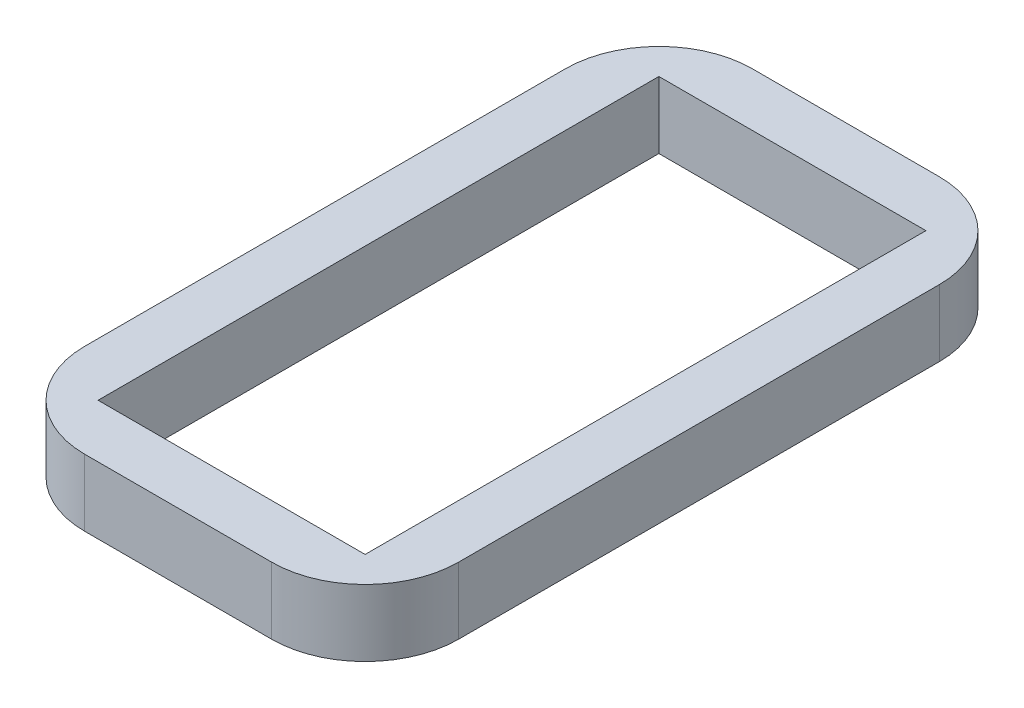
ISO-10303-21;
HEADER;
FILE_DESCRIPTION(('STEP AP214'),'2;1');
FILE_NAME('part.step','',(''),(''),'','','');
FILE_SCHEMA(('AUTOMOTIVE_DESIGN { 1 0 10303 214 1 1 1 1 }'));
ENDSEC;
DATA;
#1=APPLICATION_CONTEXT('core data for automotive mechanical design processes');
#2=APPLICATION_PROTOCOL_DEFINITION('international standard','automotive_design',2000,#1);
#3=PRODUCT_CONTEXT('',#1,'mechanical');
#4=PRODUCT('Part','Part','',(#3));
#5=PRODUCT_RELATED_PRODUCT_CATEGORY('part','',(#4));
#6=PRODUCT_DEFINITION_FORMATION('','',#4);
#7=PRODUCT_DEFINITION_CONTEXT('part definition',#1,'design');
#8=PRODUCT_DEFINITION('design','',#6,#7);
#9=PRODUCT_DEFINITION_SHAPE('','',#8);
#10=(LENGTH_UNIT() NAMED_UNIT(*) SI_UNIT(.MILLI.,.METRE.));
#11=(NAMED_UNIT(*) PLANE_ANGLE_UNIT() SI_UNIT($,.RADIAN.));
#12=(NAMED_UNIT(*) SI_UNIT($,.STERADIAN.) SOLID_ANGLE_UNIT());
#13=UNCERTAINTY_MEASURE_WITH_UNIT(LENGTH_MEASURE(1.E-05),#10,'distance_accuracy_value','');
#14=(GEOMETRIC_REPRESENTATION_CONTEXT(3) GLOBAL_UNCERTAINTY_ASSIGNED_CONTEXT((#13)) GLOBAL_UNIT_ASSIGNED_CONTEXT((#10,
#11,#12)) REPRESENTATION_CONTEXT('',''));
#15=CARTESIAN_POINT('',(0.,0.,0.));
#16=DIRECTION('',(0.,0.,1.));
#17=DIRECTION('',(1.,0.,0.));
#18=AXIS2_PLACEMENT_3D('',#15,#16,#17);
#19=CARTESIAN_POINT('',(0.,5.,0.));
#20=DIRECTION('',(0.,1.,0.));
#21=DIRECTION('',(0.,0.,1.));
#22=AXIS2_PLACEMENT_3D('',#19,#20,#21);
#23=PLANE('',#22);
#24=DIRECTION('',(-1.,0.,0.));
#25=VECTOR('',#24,1.);
#26=CARTESIAN_POINT('',(-14.,5.,-25.));
#27=LINE('',#26,#25);
#28=CARTESIAN_POINT('',(7.,5.,-25.));
#29=VERTEX_POINT('',#28);
#30=CARTESIAN_POINT('',(-7.,5.,-25.));
#31=VERTEX_POINT('',#30);
#32=EDGE_CURVE('E167',#29,#31,#27,.T.);
#33=ORIENTED_EDGE('',*,*,#32,.T.);
#34=CARTESIAN_POINT('',(-7.,5.,-18.));
#35=DIRECTION('',(0.,1.,0.));
#36=DIRECTION('',(0.,0.,1.));
#37=AXIS2_PLACEMENT_3D('',#34,#35,#36);
#38=CIRCLE('',#37,7.);
#39=CARTESIAN_POINT('',(-14.,5.,-18.));
#40=VERTEX_POINT('',#39);
#41=EDGE_CURVE('E207',#31,#40,#38,.T.);
#42=ORIENTED_EDGE('',*,*,#41,.T.);
#43=DIRECTION('',(0.,0.,1.));
#44=VECTOR('',#43,1.);
#45=CARTESIAN_POINT('',(-14.,5.,-25.));
#46=LINE('',#45,#44);
#47=CARTESIAN_POINT('',(-14.,5.,18.));
#48=VERTEX_POINT('',#47);
#49=EDGE_CURVE('E171',#40,#48,#46,.T.);
#50=ORIENTED_EDGE('',*,*,#49,.T.);
#51=CARTESIAN_POINT('',(-7.,5.,18.));
#52=DIRECTION('',(0.,1.,0.));
#53=DIRECTION('',(0.,0.,1.));
#54=AXIS2_PLACEMENT_3D('',#51,#52,#53);
#55=CIRCLE('',#54,7.);
#56=CARTESIAN_POINT('',(-7.,5.,25.));
#57=VERTEX_POINT('',#56);
#58=EDGE_CURVE('E53',#48,#57,#55,.T.);
#59=ORIENTED_EDGE('',*,*,#58,.T.);
#60=DIRECTION('',(1.,0.,0.));
#61=VECTOR('',#60,1.);
#62=CARTESIAN_POINT('',(-14.,5.,25.));
#63=LINE('',#62,#61);
#64=CARTESIAN_POINT('',(7.,5.,25.));
#65=VERTEX_POINT('',#64);
#66=EDGE_CURVE('E173',#57,#65,#63,.T.);
#67=ORIENTED_EDGE('',*,*,#66,.T.);
#68=CARTESIAN_POINT('',(7.,5.,18.));
#69=DIRECTION('',(0.,1.,0.));
#70=DIRECTION('',(0.,0.,1.));
#71=AXIS2_PLACEMENT_3D('',#68,#69,#70);
#72=CIRCLE('',#71,7.);
#73=CARTESIAN_POINT('',(14.,5.,18.));
#74=VERTEX_POINT('',#73);
#75=EDGE_CURVE('E203',#65,#74,#72,.T.);
#76=ORIENTED_EDGE('',*,*,#75,.T.);
#77=DIRECTION('',(0.,0.,-1.));
#78=VECTOR('',#77,1.);
#79=CARTESIAN_POINT('',(14.,5.,-25.));
#80=LINE('',#79,#78);
#81=CARTESIAN_POINT('',(14.,5.,-18.));
#82=VERTEX_POINT('',#81);
#83=EDGE_CURVE('E164',#74,#82,#80,.T.);
#84=ORIENTED_EDGE('',*,*,#83,.T.);
#85=CARTESIAN_POINT('',(7.,5.,-18.));
#86=DIRECTION('',(0.,1.,0.));
#87=DIRECTION('',(0.,0.,1.));
#88=AXIS2_PLACEMENT_3D('',#85,#86,#87);
#89=CIRCLE('',#88,7.);
#90=EDGE_CURVE('E205',#82,#29,#89,.T.);
#91=ORIENTED_EDGE('',*,*,#90,.T.);
#92=EDGE_LOOP('',(#33,#42,#50,#59,#67,#76,#84,#91));
#93=FACE_BOUND('',#92,.T.);
#94=DIRECTION('',(-1.,0.,0.));
#95=VECTOR('',#94,1.);
#96=CARTESIAN_POINT('',(-9.99999999999999,5.,-21.));
#97=LINE('',#96,#95);
#98=CARTESIAN_POINT('',(10.,5.,-21.));
#99=VERTEX_POINT('',#98);
#100=CARTESIAN_POINT('',(-9.99999999999999,5.,-21.));
#101=VERTEX_POINT('',#100);
#102=EDGE_CURVE('E133',#99,#101,#97,.T.);
#103=ORIENTED_EDGE('',*,*,#102,.F.);
#104=DIRECTION('',(0.,0.,-1.));
#105=VECTOR('',#104,1.);
#106=CARTESIAN_POINT('',(10.,5.,-21.));
#107=LINE('',#106,#105);
#108=CARTESIAN_POINT('',(10.,5.,21.));
#109=VERTEX_POINT('',#108);
#110=EDGE_CURVE('E123',#109,#99,#107,.T.);
#111=ORIENTED_EDGE('',*,*,#110,.F.);
#112=DIRECTION('',(1.,0.,0.));
#113=VECTOR('',#112,1.);
#114=CARTESIAN_POINT('',(-9.99999999999999,5.,21.));
#115=LINE('',#114,#113);
#116=CARTESIAN_POINT('',(-9.99999999999999,5.,21.));
#117=VERTEX_POINT('',#116);
#118=EDGE_CURVE('E148',#117,#109,#115,.T.);
#119=ORIENTED_EDGE('',*,*,#118,.F.);
#120=DIRECTION('',(0.,0.,1.));
#121=VECTOR('',#120,1.);
#122=CARTESIAN_POINT('',(-9.99999999999999,5.,-21.));
#123=LINE('',#122,#121);
#124=EDGE_CURVE('E146',#101,#117,#123,.T.);
#125=ORIENTED_EDGE('',*,*,#124,.F.);
#126=EDGE_LOOP('',(#103,#111,#119,#125));
#127=FACE_BOUND('',#126,.T.);
#128=ADVANCED_FACE('F33',(#93,#127),#23,.T.);
#129=CARTESIAN_POINT('',(0.,0.,0.));
#130=DIRECTION('',(0.,1.,0.));
#131=DIRECTION('',(0.,0.,1.));
#132=AXIS2_PLACEMENT_3D('',#129,#130,#131);
#133=PLANE('',#132);
#134=DIRECTION('',(0.,0.,1.));
#135=VECTOR('',#134,1.);
#136=CARTESIAN_POINT('',(-14.,0.,-25.));
#137=LINE('',#136,#135);
#138=CARTESIAN_POINT('',(-14.,0.,-18.));
#139=VERTEX_POINT('',#138);
#140=CARTESIAN_POINT('',(-14.,0.,18.));
#141=VERTEX_POINT('',#140);
#142=EDGE_CURVE('E181',#139,#141,#137,.T.);
#143=ORIENTED_EDGE('',*,*,#142,.F.);
#144=CARTESIAN_POINT('',(-7.,0.,-18.));
#145=DIRECTION('',(0.,1.,0.));
#146=DIRECTION('',(0.,0.,1.));
#147=AXIS2_PLACEMENT_3D('',#144,#145,#146);
#148=CIRCLE('',#147,7.);
#149=CARTESIAN_POINT('',(-7.,0.,-25.));
#150=VERTEX_POINT('',#149);
#151=EDGE_CURVE('E195',#139,#150,#148,.F.);
#152=ORIENTED_EDGE('',*,*,#151,.T.);
#153=DIRECTION('',(-1.,0.,0.));
#154=VECTOR('',#153,1.);
#155=CARTESIAN_POINT('',(-14.,0.,-25.));
#156=LINE('',#155,#154);
#157=CARTESIAN_POINT('',(7.,0.,-25.));
#158=VERTEX_POINT('',#157);
#159=EDGE_CURVE('E178',#158,#150,#156,.T.);
#160=ORIENTED_EDGE('',*,*,#159,.F.);
#161=CARTESIAN_POINT('',(7.,0.,-18.));
#162=DIRECTION('',(0.,1.,0.));
#163=DIRECTION('',(0.,0.,1.));
#164=AXIS2_PLACEMENT_3D('',#161,#162,#163);
#165=CIRCLE('',#164,7.);
#166=CARTESIAN_POINT('',(14.,0.,-18.));
#167=VERTEX_POINT('',#166);
#168=EDGE_CURVE('E193',#158,#167,#165,.F.);
#169=ORIENTED_EDGE('',*,*,#168,.T.);
#170=DIRECTION('',(0.,0.,-1.));
#171=VECTOR('',#170,1.);
#172=CARTESIAN_POINT('',(14.,0.,-25.));
#173=LINE('',#172,#171);
#174=CARTESIAN_POINT('',(14.,0.,18.));
#175=VERTEX_POINT('',#174);
#176=EDGE_CURVE('E141',#175,#167,#173,.T.);
#177=ORIENTED_EDGE('',*,*,#176,.F.);
#178=CARTESIAN_POINT('',(7.,0.,18.));
#179=DIRECTION('',(0.,1.,0.));
#180=DIRECTION('',(0.,0.,1.));
#181=AXIS2_PLACEMENT_3D('',#178,#179,#180);
#182=CIRCLE('',#181,7.);
#183=CARTESIAN_POINT('',(7.,0.,25.));
#184=VERTEX_POINT('',#183);
#185=EDGE_CURVE('E191',#175,#184,#182,.F.);
#186=ORIENTED_EDGE('',*,*,#185,.T.);
#187=DIRECTION('',(1.,0.,0.));
#188=VECTOR('',#187,1.);
#189=CARTESIAN_POINT('',(-14.,0.,25.));
#190=LINE('',#189,#188);
#191=CARTESIAN_POINT('',(-7.,0.,25.));
#192=VERTEX_POINT('',#191);
#193=EDGE_CURVE('E168',#192,#184,#190,.T.);
#194=ORIENTED_EDGE('',*,*,#193,.F.);
#195=CARTESIAN_POINT('',(-7.,0.,18.));
#196=DIRECTION('',(0.,1.,0.));
#197=DIRECTION('',(0.,0.,1.));
#198=AXIS2_PLACEMENT_3D('',#195,#196,#197);
#199=CIRCLE('',#198,7.);
#200=EDGE_CURVE('E189',#192,#141,#199,.F.);
#201=ORIENTED_EDGE('',*,*,#200,.T.);
#202=EDGE_LOOP('',(#143,#152,#160,#169,#177,#186,#194,#201));
#203=FACE_BOUND('',#202,.T.);
#204=DIRECTION('',(0.,0.,-1.));
#205=VECTOR('',#204,1.);
#206=CARTESIAN_POINT('',(10.,0.,-21.));
#207=LINE('',#206,#205);
#208=CARTESIAN_POINT('',(10.,0.,21.));
#209=VERTEX_POINT('',#208);
#210=CARTESIAN_POINT('',(10.,0.,-21.));
#211=VERTEX_POINT('',#210);
#212=EDGE_CURVE('E152',#209,#211,#207,.T.);
#213=ORIENTED_EDGE('',*,*,#212,.T.);
#214=DIRECTION('',(-1.,0.,0.));
#215=VECTOR('',#214,1.);
#216=CARTESIAN_POINT('',(-9.99999999999999,0.,-21.));
#217=LINE('',#216,#215);
#218=CARTESIAN_POINT('',(-9.99999999999999,0.,-21.));
#219=VERTEX_POINT('',#218);
#220=EDGE_CURVE('E140',#211,#219,#217,.T.);
#221=ORIENTED_EDGE('',*,*,#220,.T.);
#222=DIRECTION('',(0.,0.,1.));
#223=VECTOR('',#222,1.);
#224=CARTESIAN_POINT('',(-9.99999999999999,0.,-21.));
#225=LINE('',#224,#223);
#226=CARTESIAN_POINT('',(-9.99999999999999,0.,21.));
#227=VERTEX_POINT('',#226);
#228=EDGE_CURVE('E155',#219,#227,#225,.T.);
#229=ORIENTED_EDGE('',*,*,#228,.T.);
#230=DIRECTION('',(1.,0.,0.));
#231=VECTOR('',#230,1.);
#232=CARTESIAN_POINT('',(-9.99999999999999,0.,21.));
#233=LINE('',#232,#231);
#234=EDGE_CURVE('E134',#227,#209,#233,.T.);
#235=ORIENTED_EDGE('',*,*,#234,.T.);
#236=EDGE_LOOP('',(#213,#221,#229,#235));
#237=FACE_BOUND('',#236,.T.);
#238=ADVANCED_FACE('F220',(#203,#237),#133,.F.);
#239=CARTESIAN_POINT('',(14.,5.,-25.));
#240=DIRECTION('',(-1.,0.,0.));
#241=DIRECTION('',(0.,0.,1.));
#242=AXIS2_PLACEMENT_3D('',#239,#240,#241);
#243=PLANE('',#242);
#244=ORIENTED_EDGE('',*,*,#176,.T.);
#245=DIRECTION('',(0.,-1.,0.));
#246=VECTOR('',#245,1.);
#247=CARTESIAN_POINT('',(14.,5.,-18.));
#248=LINE('',#247,#246);
#249=EDGE_CURVE('E212',#167,#82,#248,.F.);
#250=ORIENTED_EDGE('',*,*,#249,.T.);
#251=ORIENTED_EDGE('',*,*,#83,.F.);
#252=DIRECTION('',(0.,-1.,0.));
#253=VECTOR('',#252,1.);
#254=CARTESIAN_POINT('',(14.,5.,18.));
#255=LINE('',#254,#253);
#256=EDGE_CURVE('E209',#74,#175,#255,.T.);
#257=ORIENTED_EDGE('',*,*,#256,.T.);
#258=EDGE_LOOP('',(#244,#250,#251,#257));
#259=FACE_BOUND('',#258,.T.);
#260=ADVANCED_FACE('F229',(#259),#243,.F.);
#261=CARTESIAN_POINT('',(-14.,5.,-25.));
#262=DIRECTION('',(0.,0.,1.));
#263=DIRECTION('',(1.,0.,0.));
#264=AXIS2_PLACEMENT_3D('',#261,#262,#263);
#265=PLANE('',#264);
#266=ORIENTED_EDGE('',*,*,#159,.T.);
#267=DIRECTION('',(0.,-1.,0.));
#268=VECTOR('',#267,1.);
#269=CARTESIAN_POINT('',(-7.,5.,-25.));
#270=LINE('',#269,#268);
#271=EDGE_CURVE('E200',#150,#31,#270,.F.);
#272=ORIENTED_EDGE('',*,*,#271,.T.);
#273=ORIENTED_EDGE('',*,*,#32,.F.);
#274=DIRECTION('',(0.,-1.,0.));
#275=VECTOR('',#274,1.);
#276=CARTESIAN_POINT('',(7.,5.,-25.));
#277=LINE('',#276,#275);
#278=EDGE_CURVE('E197',#29,#158,#277,.T.);
#279=ORIENTED_EDGE('',*,*,#278,.T.);
#280=EDGE_LOOP('',(#266,#272,#273,#279));
#281=FACE_BOUND('',#280,.T.);
#282=ADVANCED_FACE('F238',(#281),#265,.F.);
#283=CARTESIAN_POINT('',(-14.,5.,-25.));
#284=DIRECTION('',(1.,0.,0.));
#285=DIRECTION('',(0.,0.,-1.));
#286=AXIS2_PLACEMENT_3D('',#283,#284,#285);
#287=PLANE('',#286);
#288=ORIENTED_EDGE('',*,*,#49,.F.);
#289=DIRECTION('',(0.,-1.,0.));
#290=VECTOR('',#289,1.);
#291=CARTESIAN_POINT('',(-14.,5.,-18.));
#292=LINE('',#291,#290);
#293=EDGE_CURVE('E186',#40,#139,#292,.T.);
#294=ORIENTED_EDGE('',*,*,#293,.T.);
#295=ORIENTED_EDGE('',*,*,#142,.T.);
#296=DIRECTION('',(0.,-1.,0.));
#297=VECTOR('',#296,1.);
#298=CARTESIAN_POINT('',(-14.,5.,18.));
#299=LINE('',#298,#297);
#300=EDGE_CURVE('E175',#141,#48,#299,.F.);
#301=ORIENTED_EDGE('',*,*,#300,.T.);
#302=EDGE_LOOP('',(#288,#294,#295,#301));
#303=FACE_BOUND('',#302,.T.);
#304=ADVANCED_FACE('F246',(#303),#287,.F.);
#305=CARTESIAN_POINT('',(-14.,5.,25.));
#306=DIRECTION('',(0.,0.,-1.));
#307=DIRECTION('',(-1.,0.,0.));
#308=AXIS2_PLACEMENT_3D('',#305,#306,#307);
#309=PLANE('',#308);
#310=ORIENTED_EDGE('',*,*,#193,.T.);
#311=DIRECTION('',(0.,-1.,0.));
#312=VECTOR('',#311,1.);
#313=CARTESIAN_POINT('',(7.,5.,25.));
#314=LINE('',#313,#312);
#315=EDGE_CURVE('E11',#184,#65,#314,.F.);
#316=ORIENTED_EDGE('',*,*,#315,.T.);
#317=ORIENTED_EDGE('',*,*,#66,.F.);
#318=DIRECTION('',(0.,-1.,0.));
#319=VECTOR('',#318,1.);
#320=CARTESIAN_POINT('',(-7.,5.,25.));
#321=LINE('',#320,#319);
#322=EDGE_CURVE('E41',#57,#192,#321,.T.);
#323=ORIENTED_EDGE('',*,*,#322,.T.);
#324=EDGE_LOOP('',(#310,#316,#317,#323));
#325=FACE_BOUND('',#324,.T.);
#326=ADVANCED_FACE('F216',(#325),#309,.F.);
#327=CARTESIAN_POINT('',(10.,5.,-21.));
#328=DIRECTION('',(-1.,0.,0.));
#329=DIRECTION('',(0.,0.,1.));
#330=AXIS2_PLACEMENT_3D('',#327,#328,#329);
#331=PLANE('',#330);
#332=ORIENTED_EDGE('',*,*,#212,.F.);
#333=DIRECTION('',(0.,-1.,0.));
#334=VECTOR('',#333,1.);
#335=CARTESIAN_POINT('',(10.,5.,21.));
#336=LINE('',#335,#334);
#337=EDGE_CURVE('E129',#109,#209,#336,.T.);
#338=ORIENTED_EDGE('',*,*,#337,.F.);
#339=ORIENTED_EDGE('',*,*,#110,.T.);
#340=DIRECTION('',(0.,-1.,0.));
#341=VECTOR('',#340,1.);
#342=CARTESIAN_POINT('',(10.,5.,-21.));
#343=LINE('',#342,#341);
#344=EDGE_CURVE('E126',#99,#211,#343,.T.);
#345=ORIENTED_EDGE('',*,*,#344,.T.);
#346=EDGE_LOOP('',(#332,#338,#339,#345));
#347=FACE_BOUND('',#346,.T.);
#348=ADVANCED_FACE('F125',(#347),#331,.T.);
#349=CARTESIAN_POINT('',(-9.99999999999999,5.,-21.));
#350=DIRECTION('',(0.,0.,1.));
#351=DIRECTION('',(1.,0.,0.));
#352=AXIS2_PLACEMENT_3D('',#349,#350,#351);
#353=PLANE('',#352);
#354=ORIENTED_EDGE('',*,*,#220,.F.);
#355=ORIENTED_EDGE('',*,*,#344,.F.);
#356=ORIENTED_EDGE('',*,*,#102,.T.);
#357=DIRECTION('',(0.,-1.,0.));
#358=VECTOR('',#357,1.);
#359=CARTESIAN_POINT('',(-9.99999999999999,5.,-21.));
#360=LINE('',#359,#358);
#361=EDGE_CURVE('E142',#101,#219,#360,.T.);
#362=ORIENTED_EDGE('',*,*,#361,.T.);
#363=EDGE_LOOP('',(#354,#355,#356,#362));
#364=FACE_BOUND('',#363,.T.);
#365=ADVANCED_FACE('F137',(#364),#353,.T.);
#366=CARTESIAN_POINT('',(-9.99999999999999,5.,-21.));
#367=DIRECTION('',(1.,0.,0.));
#368=DIRECTION('',(0.,0.,-1.));
#369=AXIS2_PLACEMENT_3D('',#366,#367,#368);
#370=PLANE('',#369);
#371=ORIENTED_EDGE('',*,*,#228,.F.);
#372=ORIENTED_EDGE('',*,*,#361,.F.);
#373=ORIENTED_EDGE('',*,*,#124,.T.);
#374=DIRECTION('',(0.,-1.,0.));
#375=VECTOR('',#374,1.);
#376=CARTESIAN_POINT('',(-9.99999999999999,5.,21.));
#377=LINE('',#376,#375);
#378=EDGE_CURVE('E161',#117,#227,#377,.T.);
#379=ORIENTED_EDGE('',*,*,#378,.T.);
#380=EDGE_LOOP('',(#371,#372,#373,#379));
#381=FACE_BOUND('',#380,.T.);
#382=ADVANCED_FACE('F302',(#381),#370,.T.);
#383=CARTESIAN_POINT('',(-9.99999999999999,5.,21.));
#384=DIRECTION('',(0.,0.,-1.));
#385=DIRECTION('',(-1.,0.,0.));
#386=AXIS2_PLACEMENT_3D('',#383,#384,#385);
#387=PLANE('',#386);
#388=ORIENTED_EDGE('',*,*,#234,.F.);
#389=ORIENTED_EDGE('',*,*,#378,.F.);
#390=ORIENTED_EDGE('',*,*,#118,.T.);
#391=ORIENTED_EDGE('',*,*,#337,.T.);
#392=EDGE_LOOP('',(#388,#389,#390,#391));
#393=FACE_BOUND('',#392,.T.);
#394=ADVANCED_FACE('F271',(#393),#387,.T.);
#395=CARTESIAN_POINT('',(-7.,5.,-18.));
#396=DIRECTION('',(0.,-1.,0.));
#397=DIRECTION('',(0.,0.,-1.));
#398=AXIS2_PLACEMENT_3D('',#395,#396,#397);
#399=CYLINDRICAL_SURFACE('',#398,7.);
#400=ORIENTED_EDGE('',*,*,#41,.F.);
#401=ORIENTED_EDGE('',*,*,#271,.F.);
#402=ORIENTED_EDGE('',*,*,#151,.F.);
#403=ORIENTED_EDGE('',*,*,#293,.F.);
#404=EDGE_LOOP('',(#400,#401,#402,#403));
#405=FACE_BOUND('',#404,.T.);
#406=ADVANCED_FACE('F243',(#405),#399,.T.);
#407=CARTESIAN_POINT('',(7.,5.,-18.));
#408=DIRECTION('',(0.,-1.,0.));
#409=DIRECTION('',(0.,0.,-1.));
#410=AXIS2_PLACEMENT_3D('',#407,#408,#409);
#411=CYLINDRICAL_SURFACE('',#410,7.);
#412=ORIENTED_EDGE('',*,*,#90,.F.);
#413=ORIENTED_EDGE('',*,*,#249,.F.);
#414=ORIENTED_EDGE('',*,*,#168,.F.);
#415=ORIENTED_EDGE('',*,*,#278,.F.);
#416=EDGE_LOOP('',(#412,#413,#414,#415));
#417=FACE_BOUND('',#416,.T.);
#418=ADVANCED_FACE('F235',(#417),#411,.T.);
#419=CARTESIAN_POINT('',(7.,5.,18.));
#420=DIRECTION('',(0.,-1.,0.));
#421=DIRECTION('',(0.,0.,-1.));
#422=AXIS2_PLACEMENT_3D('',#419,#420,#421);
#423=CYLINDRICAL_SURFACE('',#422,7.);
#424=ORIENTED_EDGE('',*,*,#75,.F.);
#425=ORIENTED_EDGE('',*,*,#315,.F.);
#426=ORIENTED_EDGE('',*,*,#185,.F.);
#427=ORIENTED_EDGE('',*,*,#256,.F.);
#428=EDGE_LOOP('',(#424,#425,#426,#427));
#429=FACE_BOUND('',#428,.T.);
#430=ADVANCED_FACE('F226',(#429),#423,.T.);
#431=CARTESIAN_POINT('',(-7.,5.,18.));
#432=DIRECTION('',(0.,-1.,0.));
#433=DIRECTION('',(0.,0.,-1.));
#434=AXIS2_PLACEMENT_3D('',#431,#432,#433);
#435=CYLINDRICAL_SURFACE('',#434,7.);
#436=ORIENTED_EDGE('',*,*,#58,.F.);
#437=ORIENTED_EDGE('',*,*,#300,.F.);
#438=ORIENTED_EDGE('',*,*,#200,.F.);
#439=ORIENTED_EDGE('',*,*,#322,.F.);
#440=EDGE_LOOP('',(#436,#437,#438,#439));
#441=FACE_BOUND('',#440,.T.);
#442=ADVANCED_FACE('F35',(#441),#435,.T.);
#443=CLOSED_SHELL('',(#128,#238,#260,#282,#304,#326,#348,#365,#382,#394,#406,#418,#430,#442));
#444=MANIFOLD_SOLID_BREP('B2',#443);
#445=ADVANCED_BREP_SHAPE_REPRESENTATION('',(#18,#444),#14);
#446=SHAPE_DEFINITION_REPRESENTATION(#9,#445);
ENDSEC;
END-ISO-10303-21;
